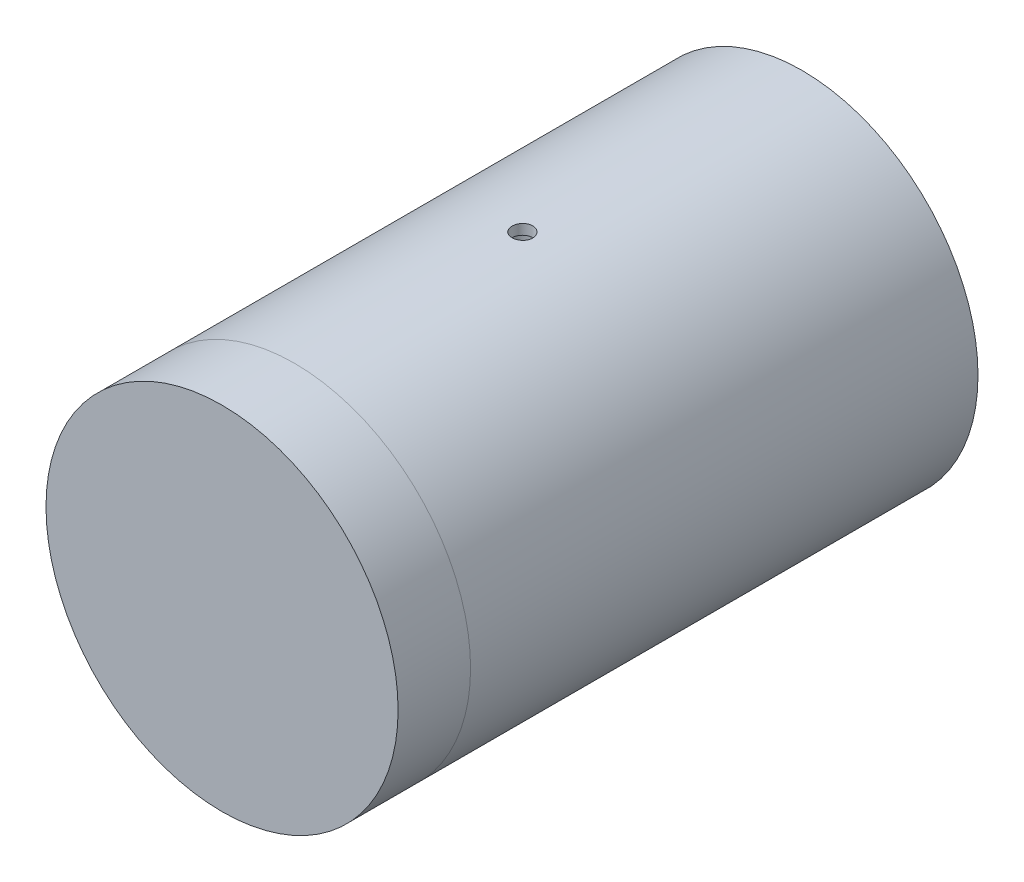
ISO-10303-21;
HEADER;
FILE_DESCRIPTION(('STEP AP214'),'2;1');
FILE_NAME('part.step','',(''),(''),'','','');
FILE_SCHEMA(('AUTOMOTIVE_DESIGN { 1 0 10303 214 1 1 1 1 }'));
ENDSEC;
DATA;
#1=APPLICATION_CONTEXT('core data for automotive mechanical design processes');
#2=APPLICATION_PROTOCOL_DEFINITION('international standard','automotive_design',2000,#1);
#3=PRODUCT_CONTEXT('',#1,'mechanical');
#4=PRODUCT('Part','Part','',(#3));
#5=PRODUCT_RELATED_PRODUCT_CATEGORY('part','',(#4));
#6=PRODUCT_DEFINITION_FORMATION('','',#4);
#7=PRODUCT_DEFINITION_CONTEXT('part definition',#1,'design');
#8=PRODUCT_DEFINITION('design','',#6,#7);
#9=PRODUCT_DEFINITION_SHAPE('','',#8);
#10=(LENGTH_UNIT() NAMED_UNIT(*) SI_UNIT(.MILLI.,.METRE.));
#11=(NAMED_UNIT(*) PLANE_ANGLE_UNIT() SI_UNIT($,.RADIAN.));
#12=(NAMED_UNIT(*) SI_UNIT($,.STERADIAN.) SOLID_ANGLE_UNIT());
#13=UNCERTAINTY_MEASURE_WITH_UNIT(LENGTH_MEASURE(1.E-05),#10,'distance_accuracy_value','');
#14=(GEOMETRIC_REPRESENTATION_CONTEXT(3) GLOBAL_UNCERTAINTY_ASSIGNED_CONTEXT((#13)) GLOBAL_UNIT_ASSIGNED_CONTEXT((#10,
#11,#12)) REPRESENTATION_CONTEXT('',''));
#15=CARTESIAN_POINT('',(0.,0.,0.));
#16=DIRECTION('',(0.,0.,1.));
#17=DIRECTION('',(1.,0.,0.));
#18=AXIS2_PLACEMENT_3D('',#15,#16,#17);
#19=CARTESIAN_POINT('',(10.2,0.,-7.));
#20=DIRECTION('',(0.,0.,-1.));
#21=DIRECTION('',(-1.,0.,0.));
#22=AXIS2_PLACEMENT_3D('',#19,#20,#21);
#23=PLANE('',#22);
#24=CARTESIAN_POINT('',(0.,0.,-7.));
#25=DIRECTION('',(0.,0.,-1.));
#26=DIRECTION('',(-1.,0.,0.));
#27=AXIS2_PLACEMENT_3D('',#24,#25,#26);
#28=CIRCLE('',#27,17.);
#29=CARTESIAN_POINT('',(-17.,0.,-7.));
#30=VERTEX_POINT('',#29);
#31=EDGE_CURVE('E56',#30,#30,#28,.F.);
#32=ORIENTED_EDGE('',*,*,#31,.F.);
#33=EDGE_LOOP('',(#32));
#34=FACE_BOUND('',#33,.T.);
#35=CARTESIAN_POINT('',(0.,0.,-7.));
#36=DIRECTION('',(0.,0.,1.));
#37=DIRECTION('',(1.,0.,0.));
#38=AXIS2_PLACEMENT_3D('',#35,#36,#37);
#39=CIRCLE('',#38,9.);
#40=CARTESIAN_POINT('',(9.,0.,-7.));
#41=VERTEX_POINT('',#40);
#42=EDGE_CURVE('E11',#41,#41,#39,.T.);
#43=ORIENTED_EDGE('',*,*,#42,.T.);
#44=EDGE_LOOP('',(#43));
#45=FACE_BOUND('',#44,.T.);
#46=ADVANCED_FACE('F52',(#34,#45),#23,.T.);
#47=CARTESIAN_POINT('',(0.,0.,-2.));
#48=DIRECTION('',(0.,0.,1.));
#49=DIRECTION('',(1.,0.,0.));
#50=AXIS2_PLACEMENT_3D('',#47,#48,#49);
#51=PLANE('',#50);
#52=CARTESIAN_POINT('',(0.,0.,-2.));
#53=DIRECTION('',(0.,0.,1.));
#54=DIRECTION('',(1.,0.,0.));
#55=AXIS2_PLACEMENT_3D('',#52,#53,#54);
#56=CIRCLE('',#55,9.);
#57=CARTESIAN_POINT('',(9.,0.,-2.));
#58=VERTEX_POINT('',#57);
#59=EDGE_CURVE('E66',#58,#58,#56,.T.);
#60=ORIENTED_EDGE('',*,*,#59,.F.);
#61=EDGE_LOOP('',(#60));
#62=FACE_BOUND('',#61,.T.);
#63=ADVANCED_FACE('F78',(#62),#51,.F.);
#64=CARTESIAN_POINT('',(0.,0.,-7.));
#65=DIRECTION('',(0.,0.,1.));
#66=DIRECTION('',(1.,0.,0.));
#67=AXIS2_PLACEMENT_3D('',#64,#65,#66);
#68=CYLINDRICAL_SURFACE('',#67,9.);
#69=ORIENTED_EDGE('',*,*,#42,.F.);
#70=EDGE_LOOP('',(#69));
#71=FACE_BOUND('',#70,.T.);
#72=ORIENTED_EDGE('',*,*,#59,.T.);
#73=EDGE_LOOP('',(#72));
#74=FACE_BOUND('',#73,.T.);
#75=ADVANCED_FACE('F83',(#71,#74),#68,.F.);
#76=CARTESIAN_POINT('',(0.,0.,-2.));
#77=DIRECTION('',(0.,0.,1.));
#78=DIRECTION('',(1.,0.,0.));
#79=AXIS2_PLACEMENT_3D('',#76,#77,#78);
#80=CYLINDRICAL_SURFACE('',#79,17.);
#81=CARTESIAN_POINT('',(0.,0.,0.));
#82=DIRECTION('',(0.,0.,1.));
#83=DIRECTION('',(1.,0.,0.));
#84=AXIS2_PLACEMENT_3D('',#81,#82,#83);
#85=CIRCLE('',#84,17.);
#86=CARTESIAN_POINT('',(17.,0.,0.));
#87=VERTEX_POINT('',#86);
#88=EDGE_CURVE('E61',#87,#87,#85,.T.);
#89=ORIENTED_EDGE('',*,*,#88,.F.);
#90=EDGE_LOOP('',(#89));
#91=FACE_BOUND('',#90,.T.);
#92=ORIENTED_EDGE('',*,*,#31,.T.);
#93=EDGE_LOOP('',(#92));
#94=FACE_BOUND('',#93,.T.);
#95=ADVANCED_FACE('F54',(#91,#94),#80,.T.);
#96=CARTESIAN_POINT('',(0.,0.,0.));
#97=DIRECTION('',(0.,0.,1.));
#98=DIRECTION('',(1.,0.,0.));
#99=AXIS2_PLACEMENT_3D('',#96,#97,#98);
#100=PLANE('',#99);
#101=ORIENTED_EDGE('',*,*,#88,.T.);
#102=EDGE_LOOP('',(#101));
#103=FACE_BOUND('',#102,.T.);
#104=ADVANCED_FACE('F79',(#103),#100,.T.);
#105=CLOSED_SHELL('',(#46,#63,#75,#95,#104));
#106=MANIFOLD_SOLID_BREP('B2',#105);
#107=CARTESIAN_POINT('',(10.2,0.,-7.));
#108=DIRECTION('',(0.,0.,-1.));
#109=DIRECTION('',(-1.,0.,0.));
#110=AXIS2_PLACEMENT_3D('',#107,#108,#109);
#111=PLANE('',#110);
#112=CARTESIAN_POINT('',(0.,0.,-7.));
#113=DIRECTION('',(0.,0.,-1.));
#114=DIRECTION('',(-1.,0.,0.));
#115=AXIS2_PLACEMENT_3D('',#112,#113,#114);
#116=CIRCLE('',#115,17.);
#117=CARTESIAN_POINT('',(-17.,0.,-7.));
#118=VERTEX_POINT('',#117);
#119=EDGE_CURVE('E139',#118,#118,#116,.F.);
#120=ORIENTED_EDGE('',*,*,#119,.T.);
#121=EDGE_LOOP('',(#120));
#122=FACE_BOUND('',#121,.T.);
#123=CARTESIAN_POINT('',(0.,0.,-7.));
#124=DIRECTION('',(0.,0.,1.));
#125=DIRECTION('',(1.,0.,0.));
#126=AXIS2_PLACEMENT_3D('',#123,#124,#125);
#127=CIRCLE('',#126,10.2);
#128=CARTESIAN_POINT('',(10.2,0.,-7.));
#129=VERTEX_POINT('',#128);
#130=EDGE_CURVE('E50',#129,#129,#127,.F.);
#131=ORIENTED_EDGE('',*,*,#130,.T.);
#132=EDGE_LOOP('',(#131));
#133=FACE_BOUND('',#132,.T.);
#134=ADVANCED_FACE('F136',(#122,#133),#111,.F.);
#135=CARTESIAN_POINT('',(0.,0.,-55.));
#136=DIRECTION('',(0.,0.,-1.));
#137=DIRECTION('',(-1.,0.,0.));
#138=AXIS2_PLACEMENT_3D('',#135,#136,#137);
#139=PLANE('',#138);
#140=CARTESIAN_POINT('',(0.,0.,-55.));
#141=DIRECTION('',(0.,0.,-1.));
#142=DIRECTION('',(-1.,0.,0.));
#143=AXIS2_PLACEMENT_3D('',#140,#141,#142);
#144=CIRCLE('',#143,5.);
#145=CARTESIAN_POINT('',(4.78340576371954,-1.45568859980928,-55.));
#146=VERTEX_POINT('',#145);
#147=CARTESIAN_POINT('',(2.26420311297507,-4.45795740930687,-55.));
#148=VERTEX_POINT('',#147);
#149=EDGE_CURVE('E216',#146,#148,#144,.T.);
#150=ORIENTED_EDGE('',*,*,#149,.F.);
#151=CARTESIAN_POINT('',(3.83022221559489,-3.21393804843269,-55.));
#152=DIRECTION('',(0.,0.,-1.));
#153=DIRECTION('',(-1.,0.,0.));
#154=AXIS2_PLACEMENT_3D('',#151,#152,#153);
#155=CIRCLE('',#154,2.);
#156=EDGE_CURVE('E220',#146,#148,#155,.T.);
#157=ORIENTED_EDGE('',*,*,#156,.T.);
#158=EDGE_LOOP('',(#150,#157));
#159=FACE_BOUND('',#158,.T.);
#160=ADVANCED_FACE('F321',(#159),#139,.T.);
#161=CARTESIAN_POINT('',(0.,0.,-55.));
#162=DIRECTION('',(0.,0.,-1.));
#163=DIRECTION('',(-1.,0.,0.));
#164=AXIS2_PLACEMENT_3D('',#161,#162,#163);
#165=PLANE('',#164);
#166=CARTESIAN_POINT('',(0.,0.,-55.));
#167=DIRECTION('',(0.,0.,-1.));
#168=DIRECTION('',(-1.,0.,0.));
#169=AXIS2_PLACEMENT_3D('',#166,#167,#168);
#170=CIRCLE('',#169,5.);
#171=CARTESIAN_POINT('',(-1.95959179422654,4.6,-55.));
#172=VERTEX_POINT('',#171);
#173=CARTESIAN_POINT('',(1.95959179422654,4.6,-55.));
#174=VERTEX_POINT('',#173);
#175=EDGE_CURVE('E233',#172,#174,#170,.T.);
#176=ORIENTED_EDGE('',*,*,#175,.F.);
#177=CARTESIAN_POINT('',(0.,5.,-55.));
#178=DIRECTION('',(0.,0.,-1.));
#179=DIRECTION('',(-1.,0.,0.));
#180=AXIS2_PLACEMENT_3D('',#177,#178,#179);
#181=CIRCLE('',#180,2.);
#182=EDGE_CURVE('E237',#172,#174,#181,.T.);
#183=ORIENTED_EDGE('',*,*,#182,.T.);
#184=EDGE_LOOP('',(#176,#183));
#185=FACE_BOUND('',#184,.T.);
#186=ADVANCED_FACE('F326',(#185),#165,.T.);
#187=CARTESIAN_POINT('',(0.,0.,-55.));
#188=DIRECTION('',(0.,0.,-1.));
#189=DIRECTION('',(-1.,0.,0.));
#190=AXIS2_PLACEMENT_3D('',#187,#188,#189);
#191=PLANE('',#190);
#192=CARTESIAN_POINT('',(0.,0.,-55.));
#193=DIRECTION('',(0.,0.,-1.));
#194=DIRECTION('',(-1.,0.,0.));
#195=AXIS2_PLACEMENT_3D('',#192,#193,#194);
#196=CIRCLE('',#195,5.);
#197=CARTESIAN_POINT('',(-2.26420311297507,-4.45795740930687,-55.));
#198=VERTEX_POINT('',#197);
#199=CARTESIAN_POINT('',(-4.78340576371954,-1.45568859980928,-55.));
#200=VERTEX_POINT('',#199);
#201=EDGE_CURVE('E191',#198,#200,#196,.T.);
#202=ORIENTED_EDGE('',*,*,#201,.F.);
#203=CARTESIAN_POINT('',(-3.83022221559489,-3.21393804843269,-55.));
#204=DIRECTION('',(0.,0.,-1.));
#205=DIRECTION('',(-1.,0.,0.));
#206=AXIS2_PLACEMENT_3D('',#203,#204,#205);
#207=CIRCLE('',#206,2.);
#208=EDGE_CURVE('E193',#198,#200,#207,.T.);
#209=ORIENTED_EDGE('',*,*,#208,.T.);
#210=EDGE_LOOP('',(#202,#209));
#211=FACE_BOUND('',#210,.T.);
#212=ADVANCED_FACE('F192',(#211),#191,.T.);
#213=CARTESIAN_POINT('',(0.,5.,-55.));
#214=DIRECTION('',(0.,0.,-1.));
#215=DIRECTION('',(-1.,0.,0.));
#216=AXIS2_PLACEMENT_3D('',#213,#214,#215);
#217=CYLINDRICAL_SURFACE('',#216,2.);
#218=CARTESIAN_POINT('',(0.,5.,-56.));
#219=DIRECTION('',(0.,0.,-1.));
#220=DIRECTION('',(-1.,0.,0.));
#221=AXIS2_PLACEMENT_3D('',#218,#219,#220);
#222=CIRCLE('',#221,2.);
#223=CARTESIAN_POINT('',(-1.95959179422654,4.6,-56.));
#224=VERTEX_POINT('',#223);
#225=CARTESIAN_POINT('',(1.95959179422654,4.6,-56.));
#226=VERTEX_POINT('',#225);
#227=EDGE_CURVE('E238',#224,#226,#222,.T.);
#228=ORIENTED_EDGE('',*,*,#227,.T.);
#229=DIRECTION('',(0.,0.,-1.));
#230=VECTOR('',#229,1.);
#231=CARTESIAN_POINT('',(1.95959179422654,4.6,-55.));
#232=LINE('',#231,#230);
#233=EDGE_CURVE('E227',#174,#226,#232,.T.);
#234=ORIENTED_EDGE('',*,*,#233,.F.);
#235=ORIENTED_EDGE('',*,*,#182,.F.);
#236=DIRECTION('',(0.,0.,-1.));
#237=VECTOR('',#236,1.);
#238=CARTESIAN_POINT('',(-1.95959179422654,4.6,-55.));
#239=LINE('',#238,#237);
#240=EDGE_CURVE('E242',#172,#224,#239,.T.);
#241=ORIENTED_EDGE('',*,*,#240,.T.);
#242=EDGE_LOOP('',(#228,#234,#235,#241));
#243=FACE_BOUND('',#242,.T.);
#244=ADVANCED_FACE('F297',(#243),#217,.F.);
#245=CARTESIAN_POINT('',(3.83022221559489,-3.21393804843269,-55.));
#246=DIRECTION('',(0.,0.,-1.));
#247=DIRECTION('',(-1.,0.,0.));
#248=AXIS2_PLACEMENT_3D('',#245,#246,#247);
#249=CYLINDRICAL_SURFACE('',#248,2.);
#250=CARTESIAN_POINT('',(3.83022221559489,-3.21393804843269,-56.));
#251=DIRECTION('',(0.,0.,-1.));
#252=DIRECTION('',(-1.,0.,0.));
#253=AXIS2_PLACEMENT_3D('',#250,#251,#252);
#254=CIRCLE('',#253,2.);
#255=CARTESIAN_POINT('',(4.78340576371954,-1.45568859980928,-56.));
#256=VERTEX_POINT('',#255);
#257=CARTESIAN_POINT('',(2.26420311297507,-4.45795740930687,-56.));
#258=VERTEX_POINT('',#257);
#259=EDGE_CURVE('E221',#256,#258,#254,.T.);
#260=ORIENTED_EDGE('',*,*,#259,.T.);
#261=DIRECTION('',(0.,0.,-1.));
#262=VECTOR('',#261,1.);
#263=CARTESIAN_POINT('',(2.26420311297507,-4.45795740930687,-55.));
#264=LINE('',#263,#262);
#265=EDGE_CURVE('E228',#148,#258,#264,.T.);
#266=ORIENTED_EDGE('',*,*,#265,.F.);
#267=ORIENTED_EDGE('',*,*,#156,.F.);
#268=DIRECTION('',(0.,0.,-1.));
#269=VECTOR('',#268,1.);
#270=CARTESIAN_POINT('',(4.78340576371954,-1.45568859980928,-55.));
#271=LINE('',#270,#269);
#272=EDGE_CURVE('E159',#146,#256,#271,.T.);
#273=ORIENTED_EDGE('',*,*,#272,.T.);
#274=EDGE_LOOP('',(#260,#266,#267,#273));
#275=FACE_BOUND('',#274,.T.);
#276=ADVANCED_FACE('F411',(#275),#249,.F.);
#277=CARTESIAN_POINT('',(-3.83022221559489,-3.21393804843269,-55.));
#278=DIRECTION('',(0.,0.,-1.));
#279=DIRECTION('',(-1.,0.,0.));
#280=AXIS2_PLACEMENT_3D('',#277,#278,#279);
#281=CYLINDRICAL_SURFACE('',#280,2.);
#282=CARTESIAN_POINT('',(-3.83022221559489,-3.21393804843269,-56.));
#283=DIRECTION('',(0.,0.,-1.));
#284=DIRECTION('',(-1.,0.,0.));
#285=AXIS2_PLACEMENT_3D('',#282,#283,#284);
#286=CIRCLE('',#285,2.);
#287=CARTESIAN_POINT('',(-2.26420311297507,-4.45795740930687,-56.));
#288=VERTEX_POINT('',#287);
#289=CARTESIAN_POINT('',(-4.78340576371954,-1.45568859980928,-56.));
#290=VERTEX_POINT('',#289);
#291=EDGE_CURVE('E197',#288,#290,#286,.T.);
#292=ORIENTED_EDGE('',*,*,#291,.T.);
#293=DIRECTION('',(0.,0.,-1.));
#294=VECTOR('',#293,1.);
#295=CARTESIAN_POINT('',(-4.78340576371954,-1.45568859980928,-55.));
#296=LINE('',#295,#294);
#297=EDGE_CURVE('E200',#200,#290,#296,.T.);
#298=ORIENTED_EDGE('',*,*,#297,.F.);
#299=ORIENTED_EDGE('',*,*,#208,.F.);
#300=DIRECTION('',(0.,0.,-1.));
#301=VECTOR('',#300,1.);
#302=CARTESIAN_POINT('',(-2.26420311297507,-4.45795740930687,-55.));
#303=LINE('',#302,#301);
#304=EDGE_CURVE('E151',#198,#288,#303,.T.);
#305=ORIENTED_EDGE('',*,*,#304,.T.);
#306=EDGE_LOOP('',(#292,#298,#299,#305));
#307=FACE_BOUND('',#306,.T.);
#308=ADVANCED_FACE('F199',(#307),#281,.F.);
#309=CARTESIAN_POINT('',(0.,16.,0.));
#310=DIRECTION('',(0.,1.,0.));
#311=DIRECTION('',(0.,0.,1.));
#312=AXIS2_PLACEMENT_3D('',#309,#310,#311);
#313=PLANE('',#312);
#314=CARTESIAN_POINT('',(0.,16.,-29.));
#315=DIRECTION('',(0.,1.,0.));
#316=DIRECTION('',(0.,0.,1.));
#317=AXIS2_PLACEMENT_3D('',#314,#315,#316);
#318=CIRCLE('',#317,1.);
#319=CARTESIAN_POINT('',(0.,16.,-28.));
#320=VERTEX_POINT('',#319);
#321=EDGE_CURVE('E212',#320,#320,#318,.F.);
#322=ORIENTED_EDGE('',*,*,#321,.F.);
#323=EDGE_LOOP('',(#322));
#324=FACE_BOUND('',#323,.T.);
#325=CARTESIAN_POINT('',(0.,16.,-29.));
#326=DIRECTION('',(0.,1.,0.));
#327=DIRECTION('',(0.,0.,1.));
#328=AXIS2_PLACEMENT_3D('',#325,#326,#327);
#329=CIRCLE('',#328,1.5);
#330=CARTESIAN_POINT('',(0.,16.,-27.5));
#331=VERTEX_POINT('',#330);
#332=EDGE_CURVE('E271',#331,#331,#329,.T.);
#333=ORIENTED_EDGE('',*,*,#332,.F.);
#334=EDGE_LOOP('',(#333));
#335=FACE_BOUND('',#334,.T.);
#336=ADVANCED_FACE('F278',(#324,#335),#313,.F.);
#337=CARTESIAN_POINT('',(0.,0.,-54.));
#338=DIRECTION('',(0.,0.,-1.));
#339=DIRECTION('',(-1.,0.,0.));
#340=AXIS2_PLACEMENT_3D('',#337,#338,#339);
#341=CYLINDRICAL_SURFACE('',#340,5.);
#342=CARTESIAN_POINT('',(0.,0.,-54.));
#343=DIRECTION('',(0.,0.,-1.));
#344=DIRECTION('',(-1.,0.,0.));
#345=AXIS2_PLACEMENT_3D('',#342,#343,#344);
#346=CIRCLE('',#345,5.);
#347=CARTESIAN_POINT('',(-5.,0.,-54.));
#348=VERTEX_POINT('',#347);
#349=EDGE_CURVE('E254',#348,#348,#346,.T.);
#350=ORIENTED_EDGE('',*,*,#349,.F.);
#351=EDGE_LOOP('',(#350));
#352=FACE_BOUND('',#351,.T.);
#353=ORIENTED_EDGE('',*,*,#201,.T.);
#354=ORIENTED_EDGE('',*,*,#297,.T.);
#355=CARTESIAN_POINT('',(0.,0.,-56.));
#356=DIRECTION('',(0.,0.,-1.));
#357=DIRECTION('',(-1.,0.,0.));
#358=AXIS2_PLACEMENT_3D('',#355,#356,#357);
#359=CIRCLE('',#358,5.);
#360=EDGE_CURVE('E253',#290,#224,#359,.T.);
#361=ORIENTED_EDGE('',*,*,#360,.T.);
#362=ORIENTED_EDGE('',*,*,#240,.F.);
#363=ORIENTED_EDGE('',*,*,#175,.T.);
#364=ORIENTED_EDGE('',*,*,#233,.T.);
#365=EDGE_CURVE('E259',#226,#256,#359,.T.);
#366=ORIENTED_EDGE('',*,*,#365,.T.);
#367=ORIENTED_EDGE('',*,*,#272,.F.);
#368=ORIENTED_EDGE('',*,*,#149,.T.);
#369=ORIENTED_EDGE('',*,*,#265,.T.);
#370=EDGE_CURVE('E207',#258,#288,#359,.T.);
#371=ORIENTED_EDGE('',*,*,#370,.T.);
#372=ORIENTED_EDGE('',*,*,#304,.F.);
#373=EDGE_LOOP('',(#353,#354,#361,#362,#363,#364,#366,#367,#368,#369,#371,#372));
#374=FACE_BOUND('',#373,.T.);
#375=ADVANCED_FACE('F204',(#352,#374),#341,.F.);
#376=CARTESIAN_POINT('',(0.,-17.001,-29.));
#377=DIRECTION('',(0.,1.,0.));
#378=DIRECTION('',(0.,0.,1.));
#379=AXIS2_PLACEMENT_3D('',#376,#377,#378);
#380=CYLINDRICAL_SURFACE('',#379,1.5);
#381=ORIENTED_EDGE('',*,*,#332,.T.);
#382=EDGE_LOOP('',(#381));
#383=FACE_BOUND('',#382,.T.);
#384=CARTESIAN_POINT('',(0.,10.2,-27.5));
#385=CARTESIAN_POINT('',(-0.0837709583601863,10.1999986758786,-27.5000034691351));
#386=CARTESIAN_POINT('',(-0.167591000845633,10.1989571778806,-27.5070412609273));
#387=CARTESIAN_POINT('',(-0.332889518608317,10.1949026648679,-27.5350001068454));
#388=CARTESIAN_POINT('',(-0.414365610813612,10.1918877126094,-27.5559348031717));
#389=CARTESIAN_POINT('',(-0.572559998892476,10.1842252101695,-27.6110495159677));
#390=CARTESIAN_POINT('',(-0.649281791924692,10.1795788771779,-27.6452196592923));
#391=CARTESIAN_POINT('',(-0.795890421912182,10.1691674544838,-27.7258114797239));
#392=CARTESIAN_POINT('',(-0.865778234247596,10.1634025247847,-27.7722314049721));
#393=CARTESIAN_POINT('',(-0.997272719875977,10.1513468320933,-27.8763772085879));
#394=CARTESIAN_POINT('',(-1.05882055429516,10.1450527942028,-27.9341770056329));
#395=CARTESIAN_POINT('',(-1.17138042522914,10.1326739915532,-28.0592827901892));
#396=CARTESIAN_POINT('',(-1.22239186498628,10.1265892386639,-28.1265893157768));
#397=CARTESIAN_POINT('',(-1.31265878315938,10.1152861272837,-28.2691917581803));
#398=CARTESIAN_POINT('',(-1.35185755045699,10.1100720002653,-28.3445239374341));
#399=CARTESIAN_POINT('',(-1.41702403146797,10.1011450534973,-28.5007922160617));
#400=CARTESIAN_POINT('',(-1.44299243808167,10.0974321551275,-28.5817280217102));
#401=CARTESIAN_POINT('',(-1.48077878582499,10.0919601535812,-28.7462881962278));
#402=CARTESIAN_POINT('',(-1.49269730248069,10.0901871702623,-28.8298890009929));
#403=CARTESIAN_POINT('',(-1.50235707618589,10.088753567205,-28.9979213683292));
#404=CARTESIAN_POINT('',(-1.50009911609248,10.0890928308235,-29.0823528847695));
#405=CARTESIAN_POINT('',(-1.48155226962465,10.0918326946901,-29.2489407169094));
#406=CARTESIAN_POINT('',(-1.46537524248586,10.0942168607954,-29.3311097954758));
#407=CARTESIAN_POINT('',(-1.41962449962311,10.1007522280441,-29.4915544665799));
#408=CARTESIAN_POINT('',(-1.39005041841363,10.1049034773952,-29.5698299528318));
#409=CARTESIAN_POINT('',(-1.31822823548456,10.1145234853338,-29.720606731031));
#410=CARTESIAN_POINT('',(-1.27593259804287,10.1199971700072,-29.7930850522748));
#411=CARTESIAN_POINT('',(-1.17990179286499,10.1316417130199,-29.9299580245377));
#412=CARTESIAN_POINT('',(-1.12616590307109,10.1378126153529,-29.9943521649114));
#413=CARTESIAN_POINT('',(-1.00816519462506,10.150228959145,-30.1138772817733));
#414=CARTESIAN_POINT('',(-0.943804171526484,10.1564745471033,-30.1689133099459));
#415=CARTESIAN_POINT('',(-0.806708482496549,10.1682814280806,-30.2674170141494));
#416=CARTESIAN_POINT('',(-0.733973782426939,10.1738427183097,-30.3108846430151));
#417=CARTESIAN_POINT('',(-0.582114262108022,10.1836598852282,-30.3850219318779));
#418=CARTESIAN_POINT('',(-0.502985900921915,10.1879150322026,-30.415684441357));
#419=CARTESIAN_POINT('',(-0.340626566939206,10.1946343178142,-30.4632594629609));
#420=CARTESIAN_POINT('',(-0.257395861001776,10.1970985727859,-30.4801728682218));
#421=CARTESIAN_POINT('',(-0.090014111569337,10.1999430491002,-30.4996437219123));
#422=CARTESIAN_POINT('',(-0.00587856658341827,10.2003422239635,-30.5023317377166));
#423=CARTESIAN_POINT('',(0.161642049248206,10.1990631040721,-30.4936218229196));
#424=CARTESIAN_POINT('',(0.245027142324686,10.1973848710622,-30.4822243109692));
#425=CARTESIAN_POINT('',(0.408285662654919,10.1921512315399,-30.4457754367215));
#426=CARTESIAN_POINT('',(0.488173557113832,10.1886045493535,-30.4207875145345));
#427=CARTESIAN_POINT('',(0.642625811804844,10.18003047583,-30.3579339157871));
#428=CARTESIAN_POINT('',(0.717189930298869,10.1750030173081,-30.3200676549061));
#429=CARTESIAN_POINT('',(0.859453311692382,10.1639791703845,-30.232224732236));
#430=CARTESIAN_POINT('',(0.92710078873004,10.1579762369324,-30.1821650385534));
#431=CARTESIAN_POINT('',(1.05308093533319,10.1456904354599,-30.0714720972269));
#432=CARTESIAN_POINT('',(1.11141308530605,10.1394075518494,-30.0108382601701));
#433=CARTESIAN_POINT('',(1.21758033976865,10.1272100725057,-29.88013769475));
#434=CARTESIAN_POINT('',(1.26532803950941,10.1212988126785,-29.8099996096155));
#435=CARTESIAN_POINT('',(1.34836394398672,10.1105724359873,-29.6626219356024));
#436=CARTESIAN_POINT('',(1.38365247498168,10.1057572904215,-29.5853825327471));
#437=CARTESIAN_POINT('',(1.44063209201393,10.0977923148957,-29.4262581012863));
#438=CARTESIAN_POINT('',(1.4623695886066,10.0946368067609,-29.3443899881756));
#439=CARTESIAN_POINT('',(1.49177804066087,10.0903331412113,-29.1781153080943));
#440=CARTESIAN_POINT('',(1.49944992659172,10.089184851015,-29.093708909412));
#441=CARTESIAN_POINT('',(1.50048788415599,10.0890304602159,-28.9256246060609));
#442=CARTESIAN_POINT('',(1.49399136745657,10.0900037831866,-28.8419475363318));
#443=CARTESIAN_POINT('',(1.46717095679316,10.0939382921992,-28.6768896123943));
#444=CARTESIAN_POINT('',(1.44684708161104,10.0968994755409,-28.5955087550673));
#445=CARTESIAN_POINT('',(1.39299677176856,10.1044689656498,-28.437388928267));
#446=CARTESIAN_POINT('',(1.3594795681722,10.1090761205614,-28.3606467564284));
#447=CARTESIAN_POINT('',(1.28020766093815,10.1194199021726,-28.2138528638727));
#448=CARTESIAN_POINT('',(1.23445257547442,10.1251565641118,-28.143801351999));
#449=CARTESIAN_POINT('',(1.1315030878845,10.1371792807035,-28.0116785493301));
#450=CARTESIAN_POINT('',(1.07420681665598,10.1434699251543,-27.9496870433924));
#451=CARTESIAN_POINT('',(0.950016572136279,10.155853208106,-27.8361495316763));
#452=CARTESIAN_POINT('',(0.883120367697712,10.1619458001721,-27.7846059608689));
#453=CARTESIAN_POINT('',(0.741214643286736,10.1732831355418,-27.6931854849219));
#454=CARTESIAN_POINT('',(0.666164150967164,10.1785232324753,-27.6533716150812));
#455=CARTESIAN_POINT('',(0.510400550586076,10.1875194748481,-27.586973419809));
#456=CARTESIAN_POINT('',(0.429693444770876,10.1912771660173,-27.56037530653));
#457=CARTESIAN_POINT('',(0.290514130912605,10.1960213077036,-27.5272402823611));
#458=CARTESIAN_POINT('',(0.232903574537191,10.1975057051415,-27.5170406679468));
#459=CARTESIAN_POINT('',(0.116869970217046,10.1994955074757,-27.5034193562529));
#460=CARTESIAN_POINT('',(0.0584469317966774,10.2000009238385,-27.4999975795871));
#461=CARTESIAN_POINT('',(0.,10.2,-27.5));
#462=B_SPLINE_CURVE_WITH_KNOTS('',3,(#384,#385,#386,#387,#388,#389,#390,#391,#392,#393,#394,
#395,#396,#397,#398,#399,#400,#401,#402,#403,#404,#405,#406,#407,#408,#409,#410,#411,#412,#413,
#414,#415,#416,#417,#418,#419,#420,#421,#422,#423,#424,#425,#426,#427,#428,#429,#430,#431,#432,
#433,#434,#435,#436,#437,#438,#439,#440,#441,#442,#443,#444,#445,#446,#447,#448,#449,#450,#451,
#452,#453,#454,#455,#456,#457,#458,#459,#460,#461),.UNSPECIFIED.,.T.,.F.,(4,2,2,2,2,2,2,2,2,2,2,
2,2,2,2,2,2,2,2,2,2,2,2,2,2,2,2,2,2,2,2,2,2,2,2,2,2,2,4),(0.,0.251099314507142,
0.502445491398109,0.753604533478106,1.00472767639288,1.25753928185151,1.51036520206629,
1.76438624822404,2.01839398942596,2.27057216730676,2.52273641946127,2.77289290648458,
3.02305621844701,3.27416616223807,3.52529195967056,3.77883065454945,4.03237038310512,
4.28605150230393,4.53971614116725,4.79104843578275,5.04237326046619,5.2925348447314,
5.54270778093383,5.79463440208972,6.04657507036712,6.30052454327215,6.55446736570953,
6.80753561825085,7.06058712919963,7.31119535281461,7.56180323602628,7.81223608553947,
8.06267674955349,8.31543328854717,8.56824866682176,8.82239887617116,9.07628337383077,
9.25147722016712,9.42666901451296),.UNSPECIFIED.);
#463=CARTESIAN_POINT('',(0.,10.2,-27.5));
#464=VERTEX_POINT('',#463);
#465=EDGE_CURVE('E258',#464,#464,#462,.T.);
#466=ORIENTED_EDGE('',*,*,#465,.T.);
#467=EDGE_LOOP('',(#466));
#468=FACE_BOUND('',#467,.T.);
#469=ADVANCED_FACE('F273',(#383,#468),#380,.F.);
#470=CARTESIAN_POINT('',(0.,0.,-54.));
#471=DIRECTION('',(0.,0.,-1.));
#472=DIRECTION('',(-1.,0.,0.));
#473=AXIS2_PLACEMENT_3D('',#470,#471,#472);
#474=PLANE('',#473);
#475=ORIENTED_EDGE('',*,*,#349,.T.);
#476=EDGE_LOOP('',(#475));
#477=FACE_BOUND('',#476,.T.);
#478=CARTESIAN_POINT('',(0.,0.,-54.));
#479=DIRECTION('',(0.,0.,-1.));
#480=DIRECTION('',(-1.,0.,0.));
#481=AXIS2_PLACEMENT_3D('',#478,#479,#480);
#482=CIRCLE('',#481,10.2);
#483=CARTESIAN_POINT('',(-10.2,0.,-54.));
#484=VERTEX_POINT('',#483);
#485=EDGE_CURVE('E307',#484,#484,#482,.F.);
#486=ORIENTED_EDGE('',*,*,#485,.T.);
#487=EDGE_LOOP('',(#486));
#488=FACE_BOUND('',#487,.T.);
#489=ADVANCED_FACE('F285',(#477,#488),#474,.F.);
#490=CARTESIAN_POINT('',(0.,0.,-56.));
#491=DIRECTION('',(0.,0.,1.));
#492=DIRECTION('',(1.,0.,0.));
#493=AXIS2_PLACEMENT_3D('',#490,#491,#492);
#494=CYLINDRICAL_SURFACE('',#493,10.2);
#495=ORIENTED_EDGE('',*,*,#485,.F.);
#496=EDGE_LOOP('',(#495));
#497=FACE_BOUND('',#496,.T.);
#498=ORIENTED_EDGE('',*,*,#465,.F.);
#499=EDGE_LOOP('',(#498));
#500=FACE_BOUND('',#499,.T.);
#501=ORIENTED_EDGE('',*,*,#130,.F.);
#502=EDGE_LOOP('',(#501));
#503=FACE_BOUND('',#502,.T.);
#504=ADVANCED_FACE('F288',(#497,#500,#503),#494,.F.);
#505=CARTESIAN_POINT('',(0.,0.,-56.));
#506=DIRECTION('',(0.,0.,1.));
#507=DIRECTION('',(1.,0.,0.));
#508=AXIS2_PLACEMENT_3D('',#505,#506,#507);
#509=PLANE('',#508);
#510=CARTESIAN_POINT('',(0.,0.,-56.));
#511=DIRECTION('',(0.,0.,1.));
#512=DIRECTION('',(1.,0.,0.));
#513=AXIS2_PLACEMENT_3D('',#510,#511,#512);
#514=CIRCLE('',#513,17.);
#515=CARTESIAN_POINT('',(17.,0.,-56.));
#516=VERTEX_POINT('',#515);
#517=EDGE_CURVE('E338',#516,#516,#514,.T.);
#518=ORIENTED_EDGE('',*,*,#517,.F.);
#519=EDGE_LOOP('',(#518));
#520=FACE_BOUND('',#519,.T.);
#521=ORIENTED_EDGE('',*,*,#360,.F.);
#522=ORIENTED_EDGE('',*,*,#291,.F.);
#523=ORIENTED_EDGE('',*,*,#370,.F.);
#524=ORIENTED_EDGE('',*,*,#259,.F.);
#525=ORIENTED_EDGE('',*,*,#365,.F.);
#526=ORIENTED_EDGE('',*,*,#227,.F.);
#527=EDGE_LOOP('',(#521,#522,#523,#524,#525,#526));
#528=FACE_BOUND('',#527,.T.);
#529=ADVANCED_FACE('F295',(#520,#528),#509,.F.);
#530=CARTESIAN_POINT('',(0.,13.1715728752538,-29.));
#531=DIRECTION('',(0.,1.,0.));
#532=DIRECTION('',(0.,0.,1.));
#533=AXIS2_PLACEMENT_3D('',#530,#531,#532);
#534=CYLINDRICAL_SURFACE('',#533,1.);
#535=CARTESIAN_POINT('',(0.,17.,-28.));
#536=CARTESIAN_POINT('',(0.0561183746501264,16.9999996082067,-28.0000024716357));
#537=CARTESIAN_POINT('',(0.112276202860598,16.9997191499508,-28.0047397791588));
#538=CARTESIAN_POINT('',(0.223041674009741,16.9986273089947,-28.023570099752));
#539=CARTESIAN_POINT('',(0.277647427794243,16.99781530595,-28.0376740445267));
#540=CARTESIAN_POINT('',(0.38368824240781,16.995752249275,-28.0748315492316));
#541=CARTESIAN_POINT('',(0.435124941635176,16.9945014247927,-28.0978804388714));
#542=CARTESIAN_POINT('',(0.533385723026011,16.9917014683063,-28.1522661123082));
#543=CARTESIAN_POINT('',(0.580210868421177,16.9901524053082,-28.1836009795363));
#544=CARTESIAN_POINT('',(0.667995846390313,16.9869278107431,-28.253715430904));
#545=CARTESIAN_POINT('',(0.708948680843567,16.9852521318566,-28.2925037707974));
#546=CARTESIAN_POINT('',(0.7837667438938,16.981964425654,-28.3764062019085));
#547=CARTESIAN_POINT('',(0.81763167845635,16.9803524009807,-28.4215205554249));
#548=CARTESIAN_POINT('',(0.87733364496531,16.9773726782667,-28.516833291706));
#549=CARTESIAN_POINT('',(0.90316494942709,16.9760051548342,-28.5670352679796));
#550=CARTESIAN_POINT('',(0.946029728558036,16.9736705291336,-28.6710729792676));
#551=CARTESIAN_POINT('',(0.963063288989445,16.9727034229622,-28.7249086788539));
#552=CARTESIAN_POINT('',(0.987829865943245,16.9712800777172,-28.8346189583736));
#553=CARTESIAN_POINT('',(0.995573725716119,16.9708232430806,-28.8904910826436));
#554=CARTESIAN_POINT('',(1.00157454952996,16.9704701732292,-29.0027439105296));
#555=CARTESIAN_POINT('',(0.999831610675698,16.9705739322763,-29.0591246089339));
#556=CARTESIAN_POINT('',(0.986917320304146,16.9713297958248,-29.1707203170552));
#557=CARTESIAN_POINT('',(0.975757696579302,16.9719812182477,-29.2259366892192));
#558=CARTESIAN_POINT('',(0.94434500290671,16.9737579197931,-29.3337110780658));
#559=CARTESIAN_POINT('',(0.924091883555518,16.9748832014898,-29.3862690803043));
#560=CARTESIAN_POINT('',(0.875053770991126,16.9774815896434,-29.4872725128612));
#561=CARTESIAN_POINT('',(0.846263449215765,16.9789549132162,-29.5357153503011));
#562=CARTESIAN_POINT('',(0.78097205059819,16.9820831249695,-29.6270849885991));
#563=CARTESIAN_POINT('',(0.744470897297473,16.9837380149503,-29.6700117347543));
#564=CARTESIAN_POINT('',(0.664727875730669,16.9870458854863,-29.7491988998026));
#565=CARTESIAN_POINT('',(0.621475855871977,16.9886988593262,-29.7854490969132));
#566=CARTESIAN_POINT('',(0.529494483315231,16.9918141927135,-29.8501753337895));
#567=CARTESIAN_POINT('',(0.480765128899694,16.9932765522012,-29.8786513711176));
#568=CARTESIAN_POINT('',(0.379206204412818,16.9958459622978,-29.9270200568789));
#569=CARTESIAN_POINT('',(0.326376454135523,16.9969529972799,-29.9469123278169));
#570=CARTESIAN_POINT('',(0.218119112458328,16.9986867904689,-29.9775420306861));
#571=CARTESIAN_POINT('',(0.162691547948043,16.999313553646,-29.9882795573548));
#572=CARTESIAN_POINT('',(0.050900666474477,17.0000155334865,-30.0002823282654));
#573=CARTESIAN_POINT('',(-0.005461127958274,17.0000915731607,-30.0015617069878));
#574=CARTESIAN_POINT('',(-0.1175985454968,16.9996857248861,-29.9946487821063));
#575=CARTESIAN_POINT('',(-0.173374171298664,16.9992038395046,-29.9864565220866));
#576=CARTESIAN_POINT('',(-0.282716235495461,16.9977369278617,-29.9608445697599));
#577=CARTESIAN_POINT('',(-0.336284195719763,16.9967522546801,-29.9434313524977));
#578=CARTESIAN_POINT('',(-0.439737273498814,16.9943905722397,-29.8998783554226));
#579=CARTESIAN_POINT('',(-0.489622361686738,16.9930135598529,-29.8737385060336));
#580=CARTESIAN_POINT('',(-0.584358423026641,16.9900199316599,-29.8134382121784));
#581=CARTESIAN_POINT('',(-0.629203371432839,16.9884030343495,-29.7792683165885));
#582=CARTESIAN_POINT('',(-0.712525543101089,16.9851125847618,-29.7038916612643));
#583=CARTESIAN_POINT('',(-0.751002710614035,16.9834390319887,-29.662684839929));
#584=CARTESIAN_POINT('',(-0.820544882253057,16.9802215212302,-29.574343117712));
#585=CARTESIAN_POINT('',(-0.851600724421362,16.978677724943,-29.5272009978921));
#586=CARTESIAN_POINT('',(-0.905356030704418,16.9758963846561,-29.4283632127282));
#587=CARTESIAN_POINT('',(-0.928055541566714,16.9746588389431,-29.3766675728599));
#588=CARTESIAN_POINT('',(-0.964437928879209,16.9726307209231,-29.270223813434));
#589=CARTESIAN_POINT('',(-0.97812659534078,16.9718398616394,-29.2154776785844));
#590=CARTESIAN_POINT('',(-0.996117641244239,16.9707935026047,-29.1044593375797));
#591=CARTESIAN_POINT('',(-1.00042010116884,16.9705379982633,-29.0481871445141));
#592=CARTESIAN_POINT('',(-0.999515838122645,16.9705912734493,-28.935805174045));
#593=CARTESIAN_POINT('',(-0.994323521596244,16.9708991980853,-28.8796952797475));
#594=CARTESIAN_POINT('',(-0.974606937601246,16.9720428201189,-28.7691454304075));
#595=CARTESIAN_POINT('',(-0.96008265292127,16.9728785184899,-28.7147054784451));
#596=CARTESIAN_POINT('',(-0.922117583314701,16.9749833032909,-28.6090384526631));
#597=CARTESIAN_POINT('',(-0.898676815664675,16.9762523888812,-28.5578113726184));
#598=CARTESIAN_POINT('',(-0.843546281111595,16.9790808989316,-28.4600182342922));
#599=CARTESIAN_POINT('',(-0.811856740354144,16.9806403154317,-28.4134520482776));
#600=CARTESIAN_POINT('',(-0.741075329876088,16.9838764922282,-28.3262297411644));
#601=CARTESIAN_POINT('',(-0.701973132288073,16.9855534141621,-28.2855820074944));
#602=CARTESIAN_POINT('',(-0.617488612819354,16.9888343021954,-28.2114140992484));
#603=CARTESIAN_POINT('',(-0.572104754109951,16.9904382503136,-28.1778956739867));
#604=CARTESIAN_POINT('',(-0.476298644798581,16.9933939396066,-28.1189160450468));
#605=CARTESIAN_POINT('',(-0.425870669756793,16.9947453891248,-28.0934641355258));
#606=CARTESIAN_POINT('',(-0.321486229260541,16.9970397610062,-28.0514192433704));
#607=CARTESIAN_POINT('',(-0.267533991546778,16.9979831628725,-28.0348158573422));
#608=CARTESIAN_POINT('',(-0.177708363856153,16.9991071850645,-28.0152672896781));
#609=CARTESIAN_POINT('',(-0.142415986844461,16.9994405079764,-28.0095494294173));
#610=CARTESIAN_POINT('',(-0.0714210672826123,16.9998870399963,-28.0019150002994));
#611=CARTESIAN_POINT('',(-0.0357185252291029,17.0000002493707,-27.99999842684));
#612=CARTESIAN_POINT('',(0.,17.,-28.));
#613=B_SPLINE_CURVE_WITH_KNOTS('',3,(#535,#536,#537,#538,#539,#540,#541,#542,#543,#544,#545,
#546,#547,#548,#549,#550,#551,#552,#553,#554,#555,#556,#557,#558,#559,#560,#561,#562,#563,#564,
#565,#566,#567,#568,#569,#570,#571,#572,#573,#574,#575,#576,#577,#578,#579,#580,#581,#582,#583,
#584,#585,#586,#587,#588,#589,#590,#591,#592,#593,#594,#595,#596,#597,#598,#599,#600,#601,#602,
#603,#604,#605,#606,#607,#608,#609,#610,#611,#612),.UNSPECIFIED.,.T.,.F.,(4,2,2,2,2,2,2,2,2,2,2,
2,2,2,2,2,2,2,2,2,2,2,2,2,2,2,2,2,2,2,2,2,2,2,2,2,2,2,4),(0.,0.168224732642648,
0.336646144457545,0.504979738968159,0.673274431475586,0.841768045505397,1.01026864793928,
1.17888910701349,1.34750792230927,1.51592972796072,1.68434980968695,1.85256044557549,
2.02077199533541,2.18908875744697,2.35740718861998,2.52598121089487,2.69455528602827,
2.86313677392696,3.03171651724715,3.20004427997714,3.36837126814283,3.5365802119171,
3.7047904968266,3.87319976059687,4.04161049869066,4.21022808551262,4.37884472902851,
4.54735292013826,4.71585966635655,4.88411094904949,5.05236254205688,5.22061380906182,
5.38886046383207,5.55734327857491,5.72586738628295,5.89458496572892,6.06310374031495,
6.17017645347565,6.27724903700141),.UNSPECIFIED.);
#614=CARTESIAN_POINT('',(0.,17.,-28.));
#615=VERTEX_POINT('',#614);
#616=EDGE_CURVE('E300',#615,#615,#613,.T.);
#617=ORIENTED_EDGE('',*,*,#616,.T.);
#618=EDGE_LOOP('',(#617));
#619=FACE_BOUND('',#618,.T.);
#620=ORIENTED_EDGE('',*,*,#321,.T.);
#621=EDGE_LOOP('',(#620));
#622=FACE_BOUND('',#621,.T.);
#623=ADVANCED_FACE('F290',(#619,#622),#534,.F.);
#624=CARTESIAN_POINT('',(0.,0.,-2.));
#625=DIRECTION('',(0.,0.,1.));
#626=DIRECTION('',(1.,0.,0.));
#627=AXIS2_PLACEMENT_3D('',#624,#625,#626);
#628=CYLINDRICAL_SURFACE('',#627,17.);
#629=ORIENTED_EDGE('',*,*,#119,.F.);
#630=EDGE_LOOP('',(#629));
#631=FACE_BOUND('',#630,.T.);
#632=ORIENTED_EDGE('',*,*,#616,.F.);
#633=EDGE_LOOP('',(#632));
#634=FACE_BOUND('',#633,.T.);
#635=ORIENTED_EDGE('',*,*,#517,.T.);
#636=EDGE_LOOP('',(#635));
#637=FACE_BOUND('',#636,.T.);
#638=ADVANCED_FACE('F294',(#631,#634,#637),#628,.T.);
#639=CLOSED_SHELL('',(#134,#160,#186,#212,#244,#276,#308,#336,#375,#469,#489,#504,#529,#623,#638));
#640=MANIFOLD_SOLID_BREP('B6',#639);
#641=ADVANCED_BREP_SHAPE_REPRESENTATION('',(#18,#106,#640),#14);
#642=SHAPE_DEFINITION_REPRESENTATION(#9,#641);
ENDSEC;
END-ISO-10303-21;
